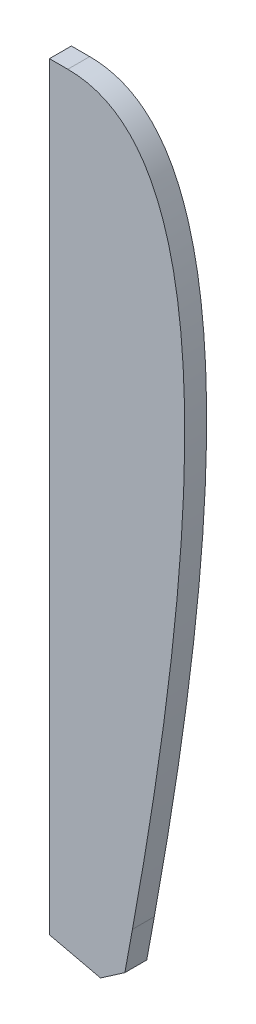
ISO-10303-21;
HEADER;
FILE_DESCRIPTION(('STEP AP214'),'2;1');
FILE_NAME('part.step','',(''),(''),'','','');
FILE_SCHEMA(('AUTOMOTIVE_DESIGN { 1 0 10303 214 1 1 1 1 }'));
ENDSEC;
DATA;
#1=APPLICATION_CONTEXT('core data for automotive mechanical design processes');
#2=APPLICATION_PROTOCOL_DEFINITION('international standard','automotive_design',2000,#1);
#3=PRODUCT_CONTEXT('',#1,'mechanical');
#4=PRODUCT('Part','Part','',(#3));
#5=PRODUCT_RELATED_PRODUCT_CATEGORY('part','',(#4));
#6=PRODUCT_DEFINITION_FORMATION('','',#4);
#7=PRODUCT_DEFINITION_CONTEXT('part definition',#1,'design');
#8=PRODUCT_DEFINITION('design','',#6,#7);
#9=PRODUCT_DEFINITION_SHAPE('','',#8);
#10=(LENGTH_UNIT() NAMED_UNIT(*) SI_UNIT(.MILLI.,.METRE.));
#11=(NAMED_UNIT(*) PLANE_ANGLE_UNIT() SI_UNIT($,.RADIAN.));
#12=(NAMED_UNIT(*) SI_UNIT($,.STERADIAN.) SOLID_ANGLE_UNIT());
#13=UNCERTAINTY_MEASURE_WITH_UNIT(LENGTH_MEASURE(1.E-05),#10,'distance_accuracy_value','');
#14=(GEOMETRIC_REPRESENTATION_CONTEXT(3) GLOBAL_UNCERTAINTY_ASSIGNED_CONTEXT((#13)) GLOBAL_UNIT_ASSIGNED_CONTEXT((#10,
#11,#12)) REPRESENTATION_CONTEXT('',''));
#15=CARTESIAN_POINT('',(0.,0.,0.));
#16=DIRECTION('',(0.,0.,1.));
#17=DIRECTION('',(1.,0.,0.));
#18=AXIS2_PLACEMENT_3D('',#15,#16,#17);
#19=CARTESIAN_POINT('',(12.6999999999999,-5480.41653499652,-12.7));
#20=DIRECTION('',(-1.,0.,0.));
#21=DIRECTION('',(0.,-1.,0.));
#22=AXIS2_PLACEMENT_3D('',#19,#20,#21);
#23=PLANE('',#22);
#24=CARTESIAN_POINT('',(12.7,-5059.38140744906,-6.35000000000008));
#25=DIRECTION('',(-1.,0.,0.));
#26=DIRECTION('',(0.,-1.,0.));
#27=AXIS2_PLACEMENT_3D('',#24,#25,#26);
#28=CIRCLE('',#27,1.5875000000003);
#29=CARTESIAN_POINT('',(12.7,-5060.96890744906,-6.35000000000008));
#30=VERTEX_POINT('',#29);
#31=EDGE_CURVE('E44',#30,#30,#28,.T.);
#32=ORIENTED_EDGE('',*,*,#31,.F.);
#33=EDGE_LOOP('',(#32));
#34=FACE_BOUND('',#33,.T.);
#35=CARTESIAN_POINT('',(12.6999999999999,-5260.37397122279,-6.35000000000005));
#36=DIRECTION('',(-1.,0.,0.));
#37=DIRECTION('',(0.,-1.,0.));
#38=AXIS2_PLACEMENT_3D('',#35,#36,#37);
#39=CIRCLE('',#38,1.5875000000003);
#40=CARTESIAN_POINT('',(12.6999999999999,-5261.96147122279,-6.35000000000005));
#41=VERTEX_POINT('',#40);
#42=EDGE_CURVE('E116',#41,#41,#39,.T.);
#43=ORIENTED_EDGE('',*,*,#42,.F.);
#44=EDGE_LOOP('',(#43));
#45=FACE_BOUND('',#44,.T.);
#46=CARTESIAN_POINT('',(12.6999999999999,-5455.01653499652,-6.35000000000002));
#47=DIRECTION('',(-1.,0.,0.));
#48=DIRECTION('',(0.,-1.,0.));
#49=AXIS2_PLACEMENT_3D('',#46,#47,#48);
#50=CIRCLE('',#49,1.5875000000003);
#51=CARTESIAN_POINT('',(12.6999999999999,-5456.60403499652,-6.35000000000002));
#52=VERTEX_POINT('',#51);
#53=EDGE_CURVE('E120',#52,#52,#50,.T.);
#54=ORIENTED_EDGE('',*,*,#53,.F.);
#55=EDGE_LOOP('',(#54));
#56=FACE_BOUND('',#55,.T.);
#57=DIRECTION('',(0.,-1.,0.));
#58=VECTOR('',#57,1.);
#59=CARTESIAN_POINT('',(12.6999999999999,-5480.41653499652,0.));
#60=LINE('',#59,#58);
#61=CARTESIAN_POINT('',(12.6999999999999,-5040.33140744906,0.));
#62=VERTEX_POINT('',#61);
#63=CARTESIAN_POINT('',(12.6999999999999,-5480.41653499652,0.));
#64=VERTEX_POINT('',#63);
#65=EDGE_CURVE('E140',#62,#64,#60,.T.);
#66=ORIENTED_EDGE('',*,*,#65,.F.);
#67=DIRECTION('',(0.,0.,1.));
#68=VECTOR('',#67,1.);
#69=CARTESIAN_POINT('',(12.6999999999999,-5040.33140744906,-12.7));
#70=LINE('',#69,#68);
#71=CARTESIAN_POINT('',(12.6999999999999,-5040.33140744906,-12.7));
#72=VERTEX_POINT('',#71);
#73=EDGE_CURVE('E157',#72,#62,#70,.T.);
#74=ORIENTED_EDGE('',*,*,#73,.F.);
#75=DIRECTION('',(0.,-1.,0.));
#76=VECTOR('',#75,1.);
#77=CARTESIAN_POINT('',(12.6999999999999,-5480.41653499652,-12.7));
#78=LINE('',#77,#76);
#79=CARTESIAN_POINT('',(12.6999999999999,-5480.41653499652,-12.7));
#80=VERTEX_POINT('',#79);
#81=EDGE_CURVE('E121',#72,#80,#78,.T.);
#82=ORIENTED_EDGE('',*,*,#81,.T.);
#83=DIRECTION('',(0.,0.,1.));
#84=VECTOR('',#83,1.);
#85=CARTESIAN_POINT('',(12.6999999999999,-5480.41653499652,-12.7));
#86=LINE('',#85,#84);
#87=EDGE_CURVE('E159',#80,#64,#86,.T.);
#88=ORIENTED_EDGE('',*,*,#87,.T.);
#89=EDGE_LOOP('',(#66,#74,#82,#88));
#90=FACE_BOUND('',#89,.T.);
#91=ADVANCED_FACE('F41',(#34,#45,#56,#90),#23,.T.);
#92=CARTESIAN_POINT('',(136.525,-5040.33140744906,-12.7));
#93=DIRECTION('',(0.,1.,0.));
#94=DIRECTION('',(-1.,0.,0.));
#95=AXIS2_PLACEMENT_3D('',#92,#93,#94);
#96=PLANE('',#95);
#97=DIRECTION('',(-1.,0.,0.));
#98=VECTOR('',#97,1.);
#99=CARTESIAN_POINT('',(136.525,-5040.33140744906,0.));
#100=LINE('',#99,#98);
#101=CARTESIAN_POINT('',(23.3417092088845,-5040.33140744906,0.));
#102=VERTEX_POINT('',#101);
#103=EDGE_CURVE('E125',#102,#62,#100,.T.);
#104=ORIENTED_EDGE('',*,*,#103,.F.);
#105=CARTESIAN_POINT('',(23.3417092088844,-5040.33140744906,-13.335));
#106=CARTESIAN_POINT('',(23.3417092088844,-5040.33140744906,-8.67833333333332));
#107=CARTESIAN_POINT('',(23.3417092088844,-5040.33140744906,-4.02166666666668));
#108=CARTESIAN_POINT('',(23.3417092088844,-5040.33140744906,0.634999999999997));
#109=(BOUNDED_CURVE() B_SPLINE_CURVE(3,(#105,#106,#107,#108),.UNSPECIFIED.,.F.,
.F.) B_SPLINE_CURVE_WITH_KNOTS((4,4),(-0.000635,0.013335),
.UNSPECIFIED.) CURVE() GEOMETRIC_REPRESENTATION_ITEM() RATIONAL_B_SPLINE_CURVE((1.,1.,1.,1.)) REPRESENTATION_ITEM(''));
#110=CARTESIAN_POINT('',(23.3417092088845,-5040.33140744906,-12.7));
#111=VERTEX_POINT('',#110);
#112=EDGE_CURVE('E239',#102,#111,#109,.F.);
#113=ORIENTED_EDGE('',*,*,#112,.T.);
#114=DIRECTION('',(-1.,0.,0.));
#115=VECTOR('',#114,1.);
#116=CARTESIAN_POINT('',(136.525,-5040.33140744906,-12.7));
#117=LINE('',#116,#115);
#118=EDGE_CURVE('E136',#111,#72,#117,.T.);
#119=ORIENTED_EDGE('',*,*,#118,.T.);
#120=ORIENTED_EDGE('',*,*,#73,.T.);
#121=EDGE_LOOP('',(#104,#113,#119,#120));
#122=FACE_BOUND('',#121,.T.);
#123=ADVANCED_FACE('F148',(#122),#96,.T.);
#124=CARTESIAN_POINT('',(54.1405577848388,-5490.04758870219,-12.7));
#125=DIRECTION('',(0.983631192592145,-0.180193443165269,0.));
#126=DIRECTION('',(0.180193443165269,0.983631192592145,0.));
#127=AXIS2_PLACEMENT_3D('',#124,#125,#126);
#128=PLANE('',#127);
#129=DIRECTION('',(0.180193443165269,0.983631192592145,0.));
#130=VECTOR('',#129,1.);
#131=CARTESIAN_POINT('',(54.1405577848388,-5490.04758870219,0.));
#132=LINE('',#131,#130);
#133=CARTESIAN_POINT('',(56.4290145130377,-5477.55547255627,0.));
#134=VERTEX_POINT('',#133);
#135=CARTESIAN_POINT('',(60.818057646648,-5453.59677763366,0.));
#136=VERTEX_POINT('',#135);
#137=EDGE_CURVE('E162',#134,#136,#132,.T.);
#138=ORIENTED_EDGE('',*,*,#137,.F.);
#139=DIRECTION('',(0.,0.,-1.));
#140=VECTOR('',#139,1.);
#141=CARTESIAN_POINT('',(56.4290145130377,-5477.55547255627,-12.7));
#142=LINE('',#141,#140);
#143=CARTESIAN_POINT('',(56.4290145130377,-5477.55547255627,-12.7));
#144=VERTEX_POINT('',#143);
#145=EDGE_CURVE('E49',#134,#144,#142,.T.);
#146=ORIENTED_EDGE('',*,*,#145,.T.);
#147=DIRECTION('',(0.180193443165269,0.983631192592145,0.));
#148=VECTOR('',#147,1.);
#149=CARTESIAN_POINT('',(54.1405577848388,-5490.04758870219,-12.7));
#150=LINE('',#149,#148);
#151=CARTESIAN_POINT('',(60.8180576466478,-5453.59677763366,-12.7));
#152=VERTEX_POINT('',#151);
#153=EDGE_CURVE('E128',#144,#152,#150,.T.);
#154=ORIENTED_EDGE('',*,*,#153,.T.);
#155=CARTESIAN_POINT('',(60.818057646648,-5453.59677763366,0.634999999999997));
#156=CARTESIAN_POINT('',(60.818057646648,-5453.59677763366,-4.02166666666668));
#157=CARTESIAN_POINT('',(60.818057646648,-5453.59677763366,-8.67833333333332));
#158=CARTESIAN_POINT('',(60.818057646648,-5453.59677763366,-13.335));
#159=(BOUNDED_CURVE() B_SPLINE_CURVE(3,(#155,#156,#157,#158),.UNSPECIFIED.,.F.,
.F.) B_SPLINE_CURVE_WITH_KNOTS((4,4),(-0.000635,0.013335),
.UNSPECIFIED.) CURVE() GEOMETRIC_REPRESENTATION_ITEM() RATIONAL_B_SPLINE_CURVE((1.,1.,1.,1.)) REPRESENTATION_ITEM(''));
#160=EDGE_CURVE('E241',#152,#136,#159,.F.);
#161=ORIENTED_EDGE('',*,*,#160,.T.);
#162=EDGE_LOOP('',(#138,#146,#154,#161));
#163=FACE_BOUND('',#162,.T.);
#164=ADVANCED_FACE('F257',(#163),#128,.T.);
#165=CARTESIAN_POINT('',(12.6999999999999,-5480.41653499652,-12.7));
#166=DIRECTION('',(-0.226373338950906,-0.974040610761285,0.));
#167=DIRECTION('',(0.974040610761285,-0.226373338950906,0.));
#168=AXIS2_PLACEMENT_3D('',#165,#166,#167);
#169=PLANE('',#168);
#170=DIRECTION('',(0.974040610761285,-0.226373338950906,0.));
#171=VECTOR('',#170,1.);
#172=CARTESIAN_POINT('',(12.6999999999999,-5480.41653499652,-12.7));
#173=LINE('',#172,#171);
#174=CARTESIAN_POINT('',(42.3147027943782,-5487.29918350166,-12.7));
#175=VERTEX_POINT('',#174);
#176=EDGE_CURVE('E124',#80,#175,#173,.T.);
#177=ORIENTED_EDGE('',*,*,#176,.T.);
#178=DIRECTION('',(0.,0.,1.));
#179=VECTOR('',#178,1.);
#180=CARTESIAN_POINT('',(42.3147027943782,-5487.29918350166,-12.7));
#181=LINE('',#180,#179);
#182=CARTESIAN_POINT('',(42.3147027943782,-5487.29918350166,0.));
#183=VERTEX_POINT('',#182);
#184=EDGE_CURVE('E170',#175,#183,#181,.T.);
#185=ORIENTED_EDGE('',*,*,#184,.T.);
#186=DIRECTION('',(0.974040610761285,-0.226373338950906,0.));
#187=VECTOR('',#186,1.);
#188=CARTESIAN_POINT('',(12.6999999999999,-5480.41653499652,0.));
#189=LINE('',#188,#187);
#190=EDGE_CURVE('E161',#64,#183,#189,.T.);
#191=ORIENTED_EDGE('',*,*,#190,.F.);
#192=ORIENTED_EDGE('',*,*,#87,.F.);
#193=EDGE_LOOP('',(#177,#185,#191,#192));
#194=FACE_BOUND('',#193,.T.);
#195=ADVANCED_FACE('F266',(#194),#169,.T.);
#196=CARTESIAN_POINT('',(0.,0.,-12.7));
#197=DIRECTION('',(0.,0.,1.));
#198=DIRECTION('',(1.,0.,0.));
#199=AXIS2_PLACEMENT_3D('',#196,#197,#198);
#200=PLANE('',#199);
#201=ORIENTED_EDGE('',*,*,#153,.F.);
#202=DIRECTION('',(0.822948292056029,0.568116280881005,0.));
#203=VECTOR('',#202,1.);
#204=CARTESIAN_POINT('',(42.3147027943783,-5487.29918350166,-12.7));
#205=LINE('',#204,#203);
#206=EDGE_CURVE('E12',#144,#175,#205,.F.);
#207=ORIENTED_EDGE('',*,*,#206,.T.);
#208=ORIENTED_EDGE('',*,*,#176,.F.);
#209=ORIENTED_EDGE('',*,*,#81,.F.);
#210=ORIENTED_EDGE('',*,*,#118,.F.);
#211=CARTESIAN_POINT('',(60.818057646648,-5453.59677763366,-12.7));
#212=CARTESIAN_POINT('',(136.525000000004,-5040.33140744906,-12.7));
#213=CARTESIAN_POINT('',(23.3417092088844,-5040.33140744906,-12.7));
#214=(BOUNDED_CURVE() B_SPLINE_CURVE(2,(#211,#212,#213),.UNSPECIFIED.,.F.,
.F.) B_SPLINE_CURVE_WITH_KNOTS((3,3),(0.,1.),
.UNSPECIFIED.) CURVE() GEOMETRIC_REPRESENTATION_ITEM() RATIONAL_B_SPLINE_CURVE((1.,1.,1.)) REPRESENTATION_ITEM(''));
#215=EDGE_CURVE('E173',#111,#152,#214,.F.);
#216=ORIENTED_EDGE('',*,*,#215,.T.);
#217=EDGE_LOOP('',(#201,#207,#208,#209,#210,#216));
#218=FACE_BOUND('',#217,.T.);
#219=ADVANCED_FACE('F270',(#218),#200,.F.);
#220=CARTESIAN_POINT('',(0.,0.,0.));
#221=DIRECTION('',(0.,0.,1.));
#222=DIRECTION('',(1.,0.,0.));
#223=AXIS2_PLACEMENT_3D('',#220,#221,#222);
#224=PLANE('',#223);
#225=ORIENTED_EDGE('',*,*,#190,.T.);
#226=DIRECTION('',(-0.822948292056029,-0.568116280881005,0.));
#227=VECTOR('',#226,1.);
#228=CARTESIAN_POINT('',(2579.13608869158,-3736.02325896618,0.));
#229=LINE('',#228,#227);
#230=EDGE_CURVE('E64',#183,#134,#229,.F.);
#231=ORIENTED_EDGE('',*,*,#230,.T.);
#232=ORIENTED_EDGE('',*,*,#137,.T.);
#233=CARTESIAN_POINT('',(23.3417092088844,-5040.33140744906,0.));
#234=CARTESIAN_POINT('',(136.525000000004,-5040.33140744906,0.));
#235=CARTESIAN_POINT('',(60.818057646648,-5453.59677763366,0.));
#236=(BOUNDED_CURVE() B_SPLINE_CURVE(2,(#233,#234,#235),.UNSPECIFIED.,.F.,
.F.) B_SPLINE_CURVE_WITH_KNOTS((3,3),(0.,1.),
.UNSPECIFIED.) CURVE() GEOMETRIC_REPRESENTATION_ITEM() RATIONAL_B_SPLINE_CURVE((1.,1.,1.)) REPRESENTATION_ITEM(''));
#237=EDGE_CURVE('E245',#136,#102,#236,.F.);
#238=ORIENTED_EDGE('',*,*,#237,.T.);
#239=ORIENTED_EDGE('',*,*,#103,.T.);
#240=ORIENTED_EDGE('',*,*,#65,.T.);
#241=EDGE_LOOP('',(#225,#231,#232,#238,#239,#240));
#242=FACE_BOUND('',#241,.T.);
#243=ADVANCED_FACE('F192',(#242),#224,.T.);
#244=CARTESIAN_POINT('',(60.818057646648,-5453.59677763366,-13.335));
#245=CARTESIAN_POINT('',(60.818057646648,-5453.59677763366,-8.67833333333332));
#246=CARTESIAN_POINT('',(60.818057646648,-5453.59677763366,-4.02166666666668));
#247=CARTESIAN_POINT('',(60.818057646648,-5453.59677763366,0.634999999999997));
#248=CARTESIAN_POINT('',(136.525000000004,-5040.33140744906,-13.335));
#249=CARTESIAN_POINT('',(136.525000000004,-5040.33140744906,-8.67833333333332));
#250=CARTESIAN_POINT('',(136.525000000004,-5040.33140744906,-4.02166666666668));
#251=CARTESIAN_POINT('',(136.525000000004,-5040.33140744906,0.634999999999997));
#252=CARTESIAN_POINT('',(23.3417092088844,-5040.33140744906,-13.335));
#253=CARTESIAN_POINT('',(23.3417092088844,-5040.33140744906,-8.67833333333332));
#254=CARTESIAN_POINT('',(23.3417092088844,-5040.33140744906,-4.02166666666668));
#255=CARTESIAN_POINT('',(23.3417092088844,-5040.33140744906,0.634999999999997));
#256=(BOUNDED_SURFACE() B_SPLINE_SURFACE(2,3,((#244,#245,#246,#247),(#248,#249,#250,#251),(#252,
#253,#254,#255)),.UNSPECIFIED.,.F.,.F.,.F.) B_SPLINE_SURFACE_WITH_KNOTS((3,3),(4,4),(0.,1.),
(-0.000635,0.013335),
.UNSPECIFIED.) GEOMETRIC_REPRESENTATION_ITEM() RATIONAL_B_SPLINE_SURFACE(((1.,1.,1.,1.),(1.,1.,
1.,1.),(1.,1.,1.,1.))) REPRESENTATION_ITEM('') SURFACE());
#257=ORIENTED_EDGE('',*,*,#215,.F.);
#258=ORIENTED_EDGE('',*,*,#112,.F.);
#259=ORIENTED_EDGE('',*,*,#237,.F.);
#260=ORIENTED_EDGE('',*,*,#160,.F.);
#261=EDGE_LOOP('',(#257,#258,#259,#260));
#262=FACE_BOUND('',#261,.T.);
#263=ADVANCED_FACE('F180',(#262),#256,.T.);
#264=CARTESIAN_POINT('',(42.3147027943783,-5487.29918350166,-12.7));
#265=DIRECTION('',(-0.568116280881005,0.822948292056029,0.));
#266=DIRECTION('',(0.,0.,1.));
#267=AXIS2_PLACEMENT_3D('',#264,#265,#266);
#268=PLANE('',#267);
#269=ORIENTED_EDGE('',*,*,#206,.F.);
#270=ORIENTED_EDGE('',*,*,#145,.F.);
#271=ORIENTED_EDGE('',*,*,#230,.F.);
#272=ORIENTED_EDGE('',*,*,#184,.F.);
#273=EDGE_LOOP('',(#269,#270,#271,#272));
#274=FACE_BOUND('',#273,.T.);
#275=ADVANCED_FACE('F43',(#274),#268,.F.);
#276=CARTESIAN_POINT('',(31.7499999999998,-5455.01653499652,-6.35000000000002));
#277=DIRECTION('',(-1.,0.,0.));
#278=DIRECTION('',(0.,0.,1.));
#279=AXIS2_PLACEMENT_3D('',#276,#277,#278);
#280=CONICAL_SURFACE('',#279,1.5875000000003,1.02974425867674);
#281=CARTESIAN_POINT('',(32.703866232706,-5455.01653499652,-6.35000000000002));
#282=VERTEX_POINT('',#281);
#283=VERTEX_LOOP('',#282);
#284=FACE_BOUND('',#283,.T.);
#285=CARTESIAN_POINT('',(31.7499999999998,-5455.01653499652,-6.35000000000002));
#286=DIRECTION('',(-1.,0.,0.));
#287=DIRECTION('',(0.,0.,1.));
#288=AXIS2_PLACEMENT_3D('',#285,#286,#287);
#289=CIRCLE('',#288,1.5875000000003);
#290=CARTESIAN_POINT('',(31.7499999999998,-5455.01653499652,-4.76249999999973));
#291=VERTEX_POINT('',#290);
#292=EDGE_CURVE('E117',#291,#291,#289,.T.);
#293=ORIENTED_EDGE('',*,*,#292,.T.);
#294=EDGE_LOOP('',(#293));
#295=FACE_BOUND('',#294,.T.);
#296=ADVANCED_FACE('F291',(#284,#295),#280,.F.);
#297=CARTESIAN_POINT('',(-19.0500000000002,-5455.01653499652,-6.35000000000002));
#298=DIRECTION('',(-1.,0.,0.));
#299=DIRECTION('',(0.,0.,1.));
#300=AXIS2_PLACEMENT_3D('',#297,#298,#299);
#301=CYLINDRICAL_SURFACE('',#300,1.5875000000003);
#302=ORIENTED_EDGE('',*,*,#53,.T.);
#303=EDGE_LOOP('',(#302));
#304=FACE_BOUND('',#303,.T.);
#305=ORIENTED_EDGE('',*,*,#292,.F.);
#306=EDGE_LOOP('',(#305));
#307=FACE_BOUND('',#306,.T.);
#308=ADVANCED_FACE('F359',(#304,#307),#301,.F.);
#309=CARTESIAN_POINT('',(31.7499999999998,-5260.37397122279,-6.35000000000005));
#310=DIRECTION('',(-1.,0.,0.));
#311=DIRECTION('',(0.,0.,1.));
#312=AXIS2_PLACEMENT_3D('',#309,#310,#311);
#313=CONICAL_SURFACE('',#312,1.5875000000003,1.02974425867674);
#314=CARTESIAN_POINT('',(32.703866232706,-5260.37397122279,-6.35000000000005));
#315=VERTEX_POINT('',#314);
#316=VERTEX_LOOP('',#315);
#317=FACE_BOUND('',#316,.T.);
#318=CARTESIAN_POINT('',(31.7499999999998,-5260.37397122279,-6.35000000000005));
#319=DIRECTION('',(-1.,0.,0.));
#320=DIRECTION('',(0.,0.,1.));
#321=AXIS2_PLACEMENT_3D('',#318,#319,#320);
#322=CIRCLE('',#321,1.5875000000003);
#323=CARTESIAN_POINT('',(31.7499999999998,-5260.37397122279,-4.76249999999975));
#324=VERTEX_POINT('',#323);
#325=EDGE_CURVE('E112',#324,#324,#322,.T.);
#326=ORIENTED_EDGE('',*,*,#325,.T.);
#327=EDGE_LOOP('',(#326));
#328=FACE_BOUND('',#327,.T.);
#329=ADVANCED_FACE('F368',(#317,#328),#313,.F.);
#330=CARTESIAN_POINT('',(-19.0500000000002,-5260.37397122279,-6.35000000000005));
#331=DIRECTION('',(-1.,0.,0.));
#332=DIRECTION('',(0.,0.,1.));
#333=AXIS2_PLACEMENT_3D('',#330,#331,#332);
#334=CYLINDRICAL_SURFACE('',#333,1.5875000000003);
#335=ORIENTED_EDGE('',*,*,#42,.T.);
#336=EDGE_LOOP('',(#335));
#337=FACE_BOUND('',#336,.T.);
#338=ORIENTED_EDGE('',*,*,#325,.F.);
#339=EDGE_LOOP('',(#338));
#340=FACE_BOUND('',#339,.T.);
#341=ADVANCED_FACE('F104',(#337,#340),#334,.F.);
#342=CARTESIAN_POINT('',(31.7499999999997,-5059.38140744906,-6.35000000000008));
#343=DIRECTION('',(-1.,0.,0.));
#344=DIRECTION('',(0.,0.,1.));
#345=AXIS2_PLACEMENT_3D('',#342,#343,#344);
#346=CONICAL_SURFACE('',#345,1.5875000000003,1.02974425867674);
#347=CARTESIAN_POINT('',(32.703866232706,-5059.38140744906,-6.35000000000008));
#348=VERTEX_POINT('',#347);
#349=VERTEX_LOOP('',#348);
#350=FACE_BOUND('',#349,.T.);
#351=CARTESIAN_POINT('',(31.7499999999997,-5059.38140744906,-6.35000000000008));
#352=DIRECTION('',(-1.,0.,0.));
#353=DIRECTION('',(0.,0.,1.));
#354=AXIS2_PLACEMENT_3D('',#351,#352,#353);
#355=CIRCLE('',#354,1.5875000000003);
#356=CARTESIAN_POINT('',(31.7499999999997,-5059.38140744906,-4.76249999999978));
#357=VERTEX_POINT('',#356);
#358=EDGE_CURVE('E108',#357,#357,#355,.T.);
#359=ORIENTED_EDGE('',*,*,#358,.T.);
#360=EDGE_LOOP('',(#359));
#361=FACE_BOUND('',#360,.T.);
#362=ADVANCED_FACE('F100',(#350,#361),#346,.F.);
#363=CARTESIAN_POINT('',(-19.0500000000003,-5059.38140744906,-6.35000000000008));
#364=DIRECTION('',(-1.,0.,0.));
#365=DIRECTION('',(0.,0.,1.));
#366=AXIS2_PLACEMENT_3D('',#363,#364,#365);
#367=CYLINDRICAL_SURFACE('',#366,1.5875000000003);
#368=ORIENTED_EDGE('',*,*,#31,.T.);
#369=EDGE_LOOP('',(#368));
#370=FACE_BOUND('',#369,.T.);
#371=ORIENTED_EDGE('',*,*,#358,.F.);
#372=EDGE_LOOP('',(#371));
#373=FACE_BOUND('',#372,.T.);
#374=ADVANCED_FACE('F103',(#370,#373),#367,.F.);
#375=CLOSED_SHELL('',(#91,#123,#164,#195,#219,#243,#263,#275,#296,#308,#329,#341,#362,#374));
#376=MANIFOLD_SOLID_BREP('B2',#375);
#377=ADVANCED_BREP_SHAPE_REPRESENTATION('',(#18,#376),#14);
#378=SHAPE_DEFINITION_REPRESENTATION(#9,#377);
ENDSEC;
END-ISO-10303-21;
